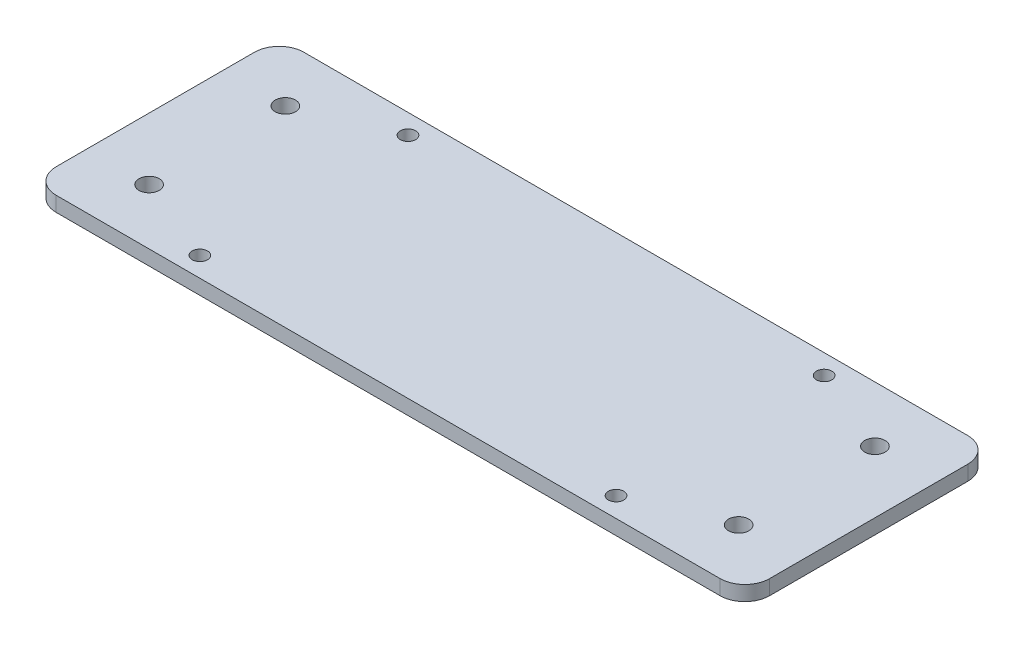
ISO-10303-21;
HEADER;
FILE_DESCRIPTION(('STEP AP214'),'2;1');
FILE_NAME('part.step','',(''),(''),'','','');
FILE_SCHEMA(('AUTOMOTIVE_DESIGN { 1 0 10303 214 1 1 1 1 }'));
ENDSEC;
DATA;
#1=APPLICATION_CONTEXT('core data for automotive mechanical design processes');
#2=APPLICATION_PROTOCOL_DEFINITION('international standard','automotive_design',2000,#1);
#3=PRODUCT_CONTEXT('',#1,'mechanical');
#4=PRODUCT('Part','Part','',(#3));
#5=PRODUCT_RELATED_PRODUCT_CATEGORY('part','',(#4));
#6=PRODUCT_DEFINITION_FORMATION('','',#4);
#7=PRODUCT_DEFINITION_CONTEXT('part definition',#1,'design');
#8=PRODUCT_DEFINITION('design','',#6,#7);
#9=PRODUCT_DEFINITION_SHAPE('','',#8);
#10=(LENGTH_UNIT() NAMED_UNIT(*) SI_UNIT(.MILLI.,.METRE.));
#11=(NAMED_UNIT(*) PLANE_ANGLE_UNIT() SI_UNIT($,.RADIAN.));
#12=(NAMED_UNIT(*) SI_UNIT($,.STERADIAN.) SOLID_ANGLE_UNIT());
#13=UNCERTAINTY_MEASURE_WITH_UNIT(LENGTH_MEASURE(1.E-05),#10,'distance_accuracy_value','');
#14=(GEOMETRIC_REPRESENTATION_CONTEXT(3) GLOBAL_UNCERTAINTY_ASSIGNED_CONTEXT((#13)) GLOBAL_UNIT_ASSIGNED_CONTEXT((#10,
#11,#12)) REPRESENTATION_CONTEXT('',''));
#15=CARTESIAN_POINT('',(0.,0.,0.));
#16=DIRECTION('',(0.,0.,1.));
#17=DIRECTION('',(1.,0.,0.));
#18=AXIS2_PLACEMENT_3D('',#15,#16,#17);
#19=CARTESIAN_POINT('',(0.,3.,0.));
#20=DIRECTION('',(0.,1.,0.));
#21=DIRECTION('',(0.,0.,1.));
#22=AXIS2_PLACEMENT_3D('',#19,#20,#21);
#23=PLANE('',#22);
#24=CARTESIAN_POINT('',(42.,3.,21.));
#25=DIRECTION('',(0.,1.,0.));
#26=DIRECTION('',(0.,0.,-1.));
#27=AXIS2_PLACEMENT_3D('',#24,#25,#26);
#28=CIRCLE('',#27,1.55);
#29=CARTESIAN_POINT('',(42.,3.,19.45));
#30=VERTEX_POINT('',#29);
#31=EDGE_CURVE('E214',#30,#30,#28,.T.);
#32=ORIENTED_EDGE('',*,*,#31,.F.);
#33=EDGE_LOOP('',(#32));
#34=FACE_BOUND('',#33,.T.);
#35=CARTESIAN_POINT('',(-59.5,3.,13.75));
#36=DIRECTION('',(0.,1.,0.));
#37=DIRECTION('',(0.,0.,1.));
#38=AXIS2_PLACEMENT_3D('',#35,#36,#37);
#39=CIRCLE('',#38,2.04999999999999);
#40=CARTESIAN_POINT('',(-59.5,3.,15.8));
#41=VERTEX_POINT('',#40);
#42=EDGE_CURVE('E202',#41,#41,#39,.T.);
#43=ORIENTED_EDGE('',*,*,#42,.F.);
#44=EDGE_LOOP('',(#43));
#45=FACE_BOUND('',#44,.T.);
#46=CARTESIAN_POINT('',(-42.,3.,-21.));
#47=DIRECTION('',(0.,1.,0.));
#48=DIRECTION('',(0.,0.,-1.));
#49=AXIS2_PLACEMENT_3D('',#46,#47,#48);
#50=CIRCLE('',#49,1.55);
#51=CARTESIAN_POINT('',(-42.,3.,-22.55));
#52=VERTEX_POINT('',#51);
#53=EDGE_CURVE('E190',#52,#52,#50,.T.);
#54=ORIENTED_EDGE('',*,*,#53,.F.);
#55=EDGE_LOOP('',(#54));
#56=FACE_BOUND('',#55,.T.);
#57=CARTESIAN_POINT('',(59.5,3.,-13.75));
#58=DIRECTION('',(0.,1.,0.));
#59=DIRECTION('',(0.,0.,1.));
#60=AXIS2_PLACEMENT_3D('',#57,#58,#59);
#61=CIRCLE('',#60,2.04999999999999);
#62=CARTESIAN_POINT('',(59.5,3.,-11.7));
#63=VERTEX_POINT('',#62);
#64=EDGE_CURVE('E180',#63,#63,#61,.T.);
#65=ORIENTED_EDGE('',*,*,#64,.F.);
#66=EDGE_LOOP('',(#65));
#67=FACE_BOUND('',#66,.T.);
#68=DIRECTION('',(-1.,0.,0.));
#69=VECTOR('',#68,1.);
#70=CARTESIAN_POINT('',(-72.,3.,-25.));
#71=LINE('',#70,#69);
#72=CARTESIAN_POINT('',(67.,3.,-25.));
#73=VERTEX_POINT('',#72);
#74=CARTESIAN_POINT('',(-67.,3.,-25.));
#75=VERTEX_POINT('',#74);
#76=EDGE_CURVE('E171',#73,#75,#71,.T.);
#77=ORIENTED_EDGE('',*,*,#76,.T.);
#78=CARTESIAN_POINT('',(-67.,3.,-20.));
#79=DIRECTION('',(0.,1.,0.));
#80=DIRECTION('',(0.,0.,1.));
#81=AXIS2_PLACEMENT_3D('',#78,#79,#80);
#82=CIRCLE('',#81,5.);
#83=CARTESIAN_POINT('',(-72.,3.,-20.));
#84=VERTEX_POINT('',#83);
#85=EDGE_CURVE('E149',#75,#84,#82,.T.);
#86=ORIENTED_EDGE('',*,*,#85,.T.);
#87=DIRECTION('',(0.,0.,1.));
#88=VECTOR('',#87,1.);
#89=CARTESIAN_POINT('',(-72.,3.,-25.));
#90=LINE('',#89,#88);
#91=CARTESIAN_POINT('',(-72.,3.,20.));
#92=VERTEX_POINT('',#91);
#93=EDGE_CURVE('E119',#84,#92,#90,.T.);
#94=ORIENTED_EDGE('',*,*,#93,.T.);
#95=CARTESIAN_POINT('',(-67.,3.,20.));
#96=DIRECTION('',(0.,1.,0.));
#97=DIRECTION('',(0.,0.,1.));
#98=AXIS2_PLACEMENT_3D('',#95,#96,#97);
#99=CIRCLE('',#98,5.);
#100=CARTESIAN_POINT('',(-67.,3.,25.));
#101=VERTEX_POINT('',#100);
#102=EDGE_CURVE('E55',#92,#101,#99,.T.);
#103=ORIENTED_EDGE('',*,*,#102,.T.);
#104=DIRECTION('',(1.,0.,0.));
#105=VECTOR('',#104,1.);
#106=CARTESIAN_POINT('',(-72.,3.,25.));
#107=LINE('',#106,#105);
#108=CARTESIAN_POINT('',(67.,3.,25.));
#109=VERTEX_POINT('',#108);
#110=EDGE_CURVE('E135',#101,#109,#107,.T.);
#111=ORIENTED_EDGE('',*,*,#110,.T.);
#112=CARTESIAN_POINT('',(67.,3.,20.));
#113=DIRECTION('',(0.,1.,0.));
#114=DIRECTION('',(0.,0.,1.));
#115=AXIS2_PLACEMENT_3D('',#112,#113,#114);
#116=CIRCLE('',#115,5.);
#117=CARTESIAN_POINT('',(72.,3.,20.));
#118=VERTEX_POINT('',#117);
#119=EDGE_CURVE('E145',#109,#118,#116,.T.);
#120=ORIENTED_EDGE('',*,*,#119,.T.);
#121=DIRECTION('',(0.,0.,-1.));
#122=VECTOR('',#121,1.);
#123=CARTESIAN_POINT('',(72.,3.,-25.));
#124=LINE('',#123,#122);
#125=CARTESIAN_POINT('',(72.,3.,-20.));
#126=VERTEX_POINT('',#125);
#127=EDGE_CURVE('E129',#118,#126,#124,.T.);
#128=ORIENTED_EDGE('',*,*,#127,.T.);
#129=CARTESIAN_POINT('',(67.,3.,-20.));
#130=DIRECTION('',(0.,1.,0.));
#131=DIRECTION('',(0.,0.,1.));
#132=AXIS2_PLACEMENT_3D('',#129,#130,#131);
#133=CIRCLE('',#132,5.);
#134=EDGE_CURVE('E147',#126,#73,#133,.T.);
#135=ORIENTED_EDGE('',*,*,#134,.T.);
#136=EDGE_LOOP('',(#77,#86,#94,#103,#111,#120,#128,#135));
#137=FACE_BOUND('',#136,.T.);
#138=CARTESIAN_POINT('',(42.,3.,-21.));
#139=DIRECTION('',(0.,1.,0.));
#140=DIRECTION('',(0.,0.,1.));
#141=AXIS2_PLACEMENT_3D('',#138,#139,#140);
#142=CIRCLE('',#141,1.55);
#143=CARTESIAN_POINT('',(42.,3.,-19.45));
#144=VERTEX_POINT('',#143);
#145=EDGE_CURVE('E185',#144,#144,#142,.T.);
#146=ORIENTED_EDGE('',*,*,#145,.F.);
#147=EDGE_LOOP('',(#146));
#148=FACE_BOUND('',#147,.T.);
#149=CARTESIAN_POINT('',(-59.5,3.,-13.75));
#150=DIRECTION('',(0.,1.,0.));
#151=DIRECTION('',(0.,0.,-1.));
#152=AXIS2_PLACEMENT_3D('',#149,#150,#151);
#153=CIRCLE('',#152,2.04999999999999);
#154=CARTESIAN_POINT('',(-59.5,3.,-15.8));
#155=VERTEX_POINT('',#154);
#156=EDGE_CURVE('E196',#155,#155,#153,.T.);
#157=ORIENTED_EDGE('',*,*,#156,.F.);
#158=EDGE_LOOP('',(#157));
#159=FACE_BOUND('',#158,.T.);
#160=CARTESIAN_POINT('',(-42.,3.,21.));
#161=DIRECTION('',(0.,1.,0.));
#162=DIRECTION('',(0.,0.,1.));
#163=AXIS2_PLACEMENT_3D('',#160,#161,#162);
#164=CIRCLE('',#163,1.55);
#165=CARTESIAN_POINT('',(-42.,3.,22.55));
#166=VERTEX_POINT('',#165);
#167=EDGE_CURVE('E208',#166,#166,#164,.T.);
#168=ORIENTED_EDGE('',*,*,#167,.F.);
#169=EDGE_LOOP('',(#168));
#170=FACE_BOUND('',#169,.T.);
#171=CARTESIAN_POINT('',(59.5,3.,13.75));
#172=DIRECTION('',(0.,1.,0.));
#173=DIRECTION('',(0.,0.,-1.));
#174=AXIS2_PLACEMENT_3D('',#171,#172,#173);
#175=CIRCLE('',#174,2.04999999999999);
#176=CARTESIAN_POINT('',(59.5,3.,11.7));
#177=VERTEX_POINT('',#176);
#178=EDGE_CURVE('E220',#177,#177,#175,.T.);
#179=ORIENTED_EDGE('',*,*,#178,.F.);
#180=EDGE_LOOP('',(#179));
#181=FACE_BOUND('',#180,.T.);
#182=ADVANCED_FACE('F35',(#34,#45,#56,#67,#137,#148,#159,#170,#181),#23,.T.);
#183=CARTESIAN_POINT('',(0.,0.,0.));
#184=DIRECTION('',(0.,1.,0.));
#185=DIRECTION('',(0.,0.,1.));
#186=AXIS2_PLACEMENT_3D('',#183,#184,#185);
#187=PLANE('',#186);
#188=DIRECTION('',(0.,0.,1.));
#189=VECTOR('',#188,1.);
#190=CARTESIAN_POINT('',(-72.,0.,-25.));
#191=LINE('',#190,#189);
#192=CARTESIAN_POINT('',(-72.,0.,-20.));
#193=VERTEX_POINT('',#192);
#194=CARTESIAN_POINT('',(-72.,0.,20.));
#195=VERTEX_POINT('',#194);
#196=EDGE_CURVE('E117',#193,#195,#191,.T.);
#197=ORIENTED_EDGE('',*,*,#196,.F.);
#198=CARTESIAN_POINT('',(-67.,0.,-20.));
#199=DIRECTION('',(0.,1.,0.));
#200=DIRECTION('',(0.,0.,1.));
#201=AXIS2_PLACEMENT_3D('',#198,#199,#200);
#202=CIRCLE('',#201,5.);
#203=CARTESIAN_POINT('',(-67.,0.,-25.));
#204=VERTEX_POINT('',#203);
#205=EDGE_CURVE('E100',#193,#204,#202,.F.);
#206=ORIENTED_EDGE('',*,*,#205,.T.);
#207=DIRECTION('',(-1.,0.,0.));
#208=VECTOR('',#207,1.);
#209=CARTESIAN_POINT('',(-72.,0.,-25.));
#210=LINE('',#209,#208);
#211=CARTESIAN_POINT('',(67.,0.,-25.));
#212=VERTEX_POINT('',#211);
#213=EDGE_CURVE('E127',#212,#204,#210,.T.);
#214=ORIENTED_EDGE('',*,*,#213,.F.);
#215=CARTESIAN_POINT('',(67.,0.,-20.));
#216=DIRECTION('',(0.,1.,0.));
#217=DIRECTION('',(0.,0.,1.));
#218=AXIS2_PLACEMENT_3D('',#215,#216,#217);
#219=CIRCLE('',#218,5.);
#220=CARTESIAN_POINT('',(72.,0.,-20.));
#221=VERTEX_POINT('',#220);
#222=EDGE_CURVE('E111',#212,#221,#219,.F.);
#223=ORIENTED_EDGE('',*,*,#222,.T.);
#224=DIRECTION('',(0.,0.,-1.));
#225=VECTOR('',#224,1.);
#226=CARTESIAN_POINT('',(72.,0.,-25.));
#227=LINE('',#226,#225);
#228=CARTESIAN_POINT('',(72.,0.,20.));
#229=VERTEX_POINT('',#228);
#230=EDGE_CURVE('E131',#229,#221,#227,.T.);
#231=ORIENTED_EDGE('',*,*,#230,.F.);
#232=CARTESIAN_POINT('',(67.,0.,20.));
#233=DIRECTION('',(0.,1.,0.));
#234=DIRECTION('',(0.,0.,1.));
#235=AXIS2_PLACEMENT_3D('',#232,#233,#234);
#236=CIRCLE('',#235,5.);
#237=CARTESIAN_POINT('',(67.,0.,25.));
#238=VERTEX_POINT('',#237);
#239=EDGE_CURVE('E138',#229,#238,#236,.F.);
#240=ORIENTED_EDGE('',*,*,#239,.T.);
#241=DIRECTION('',(1.,0.,0.));
#242=VECTOR('',#241,1.);
#243=CARTESIAN_POINT('',(-72.,0.,25.));
#244=LINE('',#243,#242);
#245=CARTESIAN_POINT('',(-67.,0.,25.));
#246=VERTEX_POINT('',#245);
#247=EDGE_CURVE('E126',#246,#238,#244,.T.);
#248=ORIENTED_EDGE('',*,*,#247,.F.);
#249=CARTESIAN_POINT('',(-67.,0.,20.));
#250=DIRECTION('',(0.,1.,0.));
#251=DIRECTION('',(0.,0.,1.));
#252=AXIS2_PLACEMENT_3D('',#249,#250,#251);
#253=CIRCLE('',#252,5.);
#254=EDGE_CURVE('E120',#246,#195,#253,.F.);
#255=ORIENTED_EDGE('',*,*,#254,.T.);
#256=EDGE_LOOP('',(#197,#206,#214,#223,#231,#240,#248,#255));
#257=FACE_BOUND('',#256,.T.);
#258=CARTESIAN_POINT('',(59.5,0.,-13.75));
#259=DIRECTION('',(0.,1.,0.));
#260=DIRECTION('',(0.,0.,1.));
#261=AXIS2_PLACEMENT_3D('',#258,#259,#260);
#262=CIRCLE('',#261,2.04999999999999);
#263=CARTESIAN_POINT('',(59.5,0.,-11.7));
#264=VERTEX_POINT('',#263);
#265=EDGE_CURVE('E176',#264,#264,#262,.T.);
#266=ORIENTED_EDGE('',*,*,#265,.T.);
#267=EDGE_LOOP('',(#266));
#268=FACE_BOUND('',#267,.T.);
#269=CARTESIAN_POINT('',(42.,0.,-21.));
#270=DIRECTION('',(0.,1.,0.));
#271=DIRECTION('',(0.,0.,1.));
#272=AXIS2_PLACEMENT_3D('',#269,#270,#271);
#273=CIRCLE('',#272,1.55);
#274=CARTESIAN_POINT('',(42.,0.,-19.45));
#275=VERTEX_POINT('',#274);
#276=EDGE_CURVE('E187',#275,#275,#273,.T.);
#277=ORIENTED_EDGE('',*,*,#276,.T.);
#278=EDGE_LOOP('',(#277));
#279=FACE_BOUND('',#278,.T.);
#280=CARTESIAN_POINT('',(-42.,0.,-21.));
#281=DIRECTION('',(0.,1.,0.));
#282=DIRECTION('',(0.,0.,-1.));
#283=AXIS2_PLACEMENT_3D('',#280,#281,#282);
#284=CIRCLE('',#283,1.55);
#285=CARTESIAN_POINT('',(-42.,0.,-22.55));
#286=VERTEX_POINT('',#285);
#287=EDGE_CURVE('E193',#286,#286,#284,.T.);
#288=ORIENTED_EDGE('',*,*,#287,.T.);
#289=EDGE_LOOP('',(#288));
#290=FACE_BOUND('',#289,.T.);
#291=CARTESIAN_POINT('',(-59.5,0.,-13.75));
#292=DIRECTION('',(0.,1.,0.));
#293=DIRECTION('',(0.,0.,-1.));
#294=AXIS2_PLACEMENT_3D('',#291,#292,#293);
#295=CIRCLE('',#294,2.04999999999999);
#296=CARTESIAN_POINT('',(-59.5,0.,-15.8));
#297=VERTEX_POINT('',#296);
#298=EDGE_CURVE('E199',#297,#297,#295,.T.);
#299=ORIENTED_EDGE('',*,*,#298,.T.);
#300=EDGE_LOOP('',(#299));
#301=FACE_BOUND('',#300,.T.);
#302=CARTESIAN_POINT('',(-59.5,0.,13.75));
#303=DIRECTION('',(0.,1.,0.));
#304=DIRECTION('',(0.,0.,1.));
#305=AXIS2_PLACEMENT_3D('',#302,#303,#304);
#306=CIRCLE('',#305,2.04999999999999);
#307=CARTESIAN_POINT('',(-59.5,0.,15.8));
#308=VERTEX_POINT('',#307);
#309=EDGE_CURVE('E205',#308,#308,#306,.T.);
#310=ORIENTED_EDGE('',*,*,#309,.T.);
#311=EDGE_LOOP('',(#310));
#312=FACE_BOUND('',#311,.T.);
#313=CARTESIAN_POINT('',(-42.,0.,21.));
#314=DIRECTION('',(0.,1.,0.));
#315=DIRECTION('',(0.,0.,1.));
#316=AXIS2_PLACEMENT_3D('',#313,#314,#315);
#317=CIRCLE('',#316,1.55);
#318=CARTESIAN_POINT('',(-42.,0.,22.55));
#319=VERTEX_POINT('',#318);
#320=EDGE_CURVE('E211',#319,#319,#317,.T.);
#321=ORIENTED_EDGE('',*,*,#320,.T.);
#322=EDGE_LOOP('',(#321));
#323=FACE_BOUND('',#322,.T.);
#324=CARTESIAN_POINT('',(42.,0.,21.));
#325=DIRECTION('',(0.,1.,0.));
#326=DIRECTION('',(0.,0.,-1.));
#327=AXIS2_PLACEMENT_3D('',#324,#325,#326);
#328=CIRCLE('',#327,1.55);
#329=CARTESIAN_POINT('',(42.,0.,19.45));
#330=VERTEX_POINT('',#329);
#331=EDGE_CURVE('E217',#330,#330,#328,.T.);
#332=ORIENTED_EDGE('',*,*,#331,.T.);
#333=EDGE_LOOP('',(#332));
#334=FACE_BOUND('',#333,.T.);
#335=CARTESIAN_POINT('',(59.5,0.,13.75));
#336=DIRECTION('',(0.,1.,0.));
#337=DIRECTION('',(0.,0.,-1.));
#338=AXIS2_PLACEMENT_3D('',#335,#336,#337);
#339=CIRCLE('',#338,2.04999999999999);
#340=CARTESIAN_POINT('',(59.5,0.,11.7));
#341=VERTEX_POINT('',#340);
#342=EDGE_CURVE('E223',#341,#341,#339,.T.);
#343=ORIENTED_EDGE('',*,*,#342,.T.);
#344=EDGE_LOOP('',(#343));
#345=FACE_BOUND('',#344,.T.);
#346=ADVANCED_FACE('F123',(#257,#268,#279,#290,#301,#312,#323,#334,#345),#187,.F.);
#347=CARTESIAN_POINT('',(72.,3.,-25.));
#348=DIRECTION('',(-1.,0.,0.));
#349=DIRECTION('',(0.,0.,1.));
#350=AXIS2_PLACEMENT_3D('',#347,#348,#349);
#351=PLANE('',#350);
#352=ORIENTED_EDGE('',*,*,#230,.T.);
#353=DIRECTION('',(0.,-1.,0.));
#354=VECTOR('',#353,1.);
#355=CARTESIAN_POINT('',(72.,3.,-20.));
#356=LINE('',#355,#354);
#357=EDGE_CURVE('E154',#221,#126,#356,.F.);
#358=ORIENTED_EDGE('',*,*,#357,.T.);
#359=ORIENTED_EDGE('',*,*,#127,.F.);
#360=DIRECTION('',(0.,-1.,0.));
#361=VECTOR('',#360,1.);
#362=CARTESIAN_POINT('',(72.,3.,20.));
#363=LINE('',#362,#361);
#364=EDGE_CURVE('E151',#118,#229,#363,.T.);
#365=ORIENTED_EDGE('',*,*,#364,.T.);
#366=EDGE_LOOP('',(#352,#358,#359,#365));
#367=FACE_BOUND('',#366,.T.);
#368=ADVANCED_FACE('F167',(#367),#351,.F.);
#369=CARTESIAN_POINT('',(-72.,3.,-25.));
#370=DIRECTION('',(0.,0.,1.));
#371=DIRECTION('',(1.,0.,0.));
#372=AXIS2_PLACEMENT_3D('',#369,#370,#371);
#373=PLANE('',#372);
#374=ORIENTED_EDGE('',*,*,#213,.T.);
#375=DIRECTION('',(0.,-1.,0.));
#376=VECTOR('',#375,1.);
#377=CARTESIAN_POINT('',(-67.,3.,-25.));
#378=LINE('',#377,#376);
#379=EDGE_CURVE('E105',#204,#75,#378,.F.);
#380=ORIENTED_EDGE('',*,*,#379,.T.);
#381=ORIENTED_EDGE('',*,*,#76,.F.);
#382=DIRECTION('',(0.,-1.,0.));
#383=VECTOR('',#382,1.);
#384=CARTESIAN_POINT('',(67.,3.,-25.));
#385=LINE('',#384,#383);
#386=EDGE_CURVE('E110',#73,#212,#385,.T.);
#387=ORIENTED_EDGE('',*,*,#386,.T.);
#388=EDGE_LOOP('',(#374,#380,#381,#387));
#389=FACE_BOUND('',#388,.T.);
#390=ADVANCED_FACE('F249',(#389),#373,.F.);
#391=CARTESIAN_POINT('',(-72.,3.,-25.));
#392=DIRECTION('',(1.,0.,0.));
#393=DIRECTION('',(0.,0.,-1.));
#394=AXIS2_PLACEMENT_3D('',#391,#392,#393);
#395=PLANE('',#394);
#396=ORIENTED_EDGE('',*,*,#93,.F.);
#397=DIRECTION('',(0.,-1.,0.));
#398=VECTOR('',#397,1.);
#399=CARTESIAN_POINT('',(-72.,3.,-20.));
#400=LINE('',#399,#398);
#401=EDGE_CURVE('E104',#84,#193,#400,.T.);
#402=ORIENTED_EDGE('',*,*,#401,.T.);
#403=ORIENTED_EDGE('',*,*,#196,.T.);
#404=DIRECTION('',(0.,-1.,0.));
#405=VECTOR('',#404,1.);
#406=CARTESIAN_POINT('',(-72.,3.,20.));
#407=LINE('',#406,#405);
#408=EDGE_CURVE('E121',#195,#92,#407,.F.);
#409=ORIENTED_EDGE('',*,*,#408,.T.);
#410=EDGE_LOOP('',(#396,#402,#403,#409));
#411=FACE_BOUND('',#410,.T.);
#412=ADVANCED_FACE('F116',(#411),#395,.F.);
#413=CARTESIAN_POINT('',(-72.,3.,25.));
#414=DIRECTION('',(0.,0.,-1.));
#415=DIRECTION('',(-1.,0.,0.));
#416=AXIS2_PLACEMENT_3D('',#413,#414,#415);
#417=PLANE('',#416);
#418=ORIENTED_EDGE('',*,*,#247,.T.);
#419=DIRECTION('',(0.,-1.,0.));
#420=VECTOR('',#419,1.);
#421=CARTESIAN_POINT('',(67.,3.,25.));
#422=LINE('',#421,#420);
#423=EDGE_CURVE('E11',#238,#109,#422,.F.);
#424=ORIENTED_EDGE('',*,*,#423,.T.);
#425=ORIENTED_EDGE('',*,*,#110,.F.);
#426=DIRECTION('',(0.,-1.,0.));
#427=VECTOR('',#426,1.);
#428=CARTESIAN_POINT('',(-67.,3.,25.));
#429=LINE('',#428,#427);
#430=EDGE_CURVE('E43',#101,#246,#429,.T.);
#431=ORIENTED_EDGE('',*,*,#430,.T.);
#432=EDGE_LOOP('',(#418,#424,#425,#431));
#433=FACE_BOUND('',#432,.T.);
#434=ADVANCED_FACE('F157',(#433),#417,.F.);
#435=CARTESIAN_POINT('',(59.5,3.,-13.75));
#436=DIRECTION('',(0.,-1.,0.));
#437=DIRECTION('',(0.,0.,-1.));
#438=AXIS2_PLACEMENT_3D('',#435,#436,#437);
#439=CYLINDRICAL_SURFACE('',#438,2.04999999999999);
#440=ORIENTED_EDGE('',*,*,#64,.T.);
#441=EDGE_LOOP('',(#440));
#442=FACE_BOUND('',#441,.T.);
#443=ORIENTED_EDGE('',*,*,#265,.F.);
#444=EDGE_LOOP('',(#443));
#445=FACE_BOUND('',#444,.T.);
#446=ADVANCED_FACE('F242',(#442,#445),#439,.F.);
#447=CARTESIAN_POINT('',(42.,3.,-21.));
#448=DIRECTION('',(0.,-1.,0.));
#449=DIRECTION('',(0.,0.,-1.));
#450=AXIS2_PLACEMENT_3D('',#447,#448,#449);
#451=CYLINDRICAL_SURFACE('',#450,1.55);
#452=ORIENTED_EDGE('',*,*,#145,.T.);
#453=EDGE_LOOP('',(#452));
#454=FACE_BOUND('',#453,.T.);
#455=ORIENTED_EDGE('',*,*,#276,.F.);
#456=EDGE_LOOP('',(#455));
#457=FACE_BOUND('',#456,.T.);
#458=ADVANCED_FACE('F304',(#454,#457),#451,.F.);
#459=CARTESIAN_POINT('',(-42.,3.,-21.));
#460=DIRECTION('',(0.,-1.,0.));
#461=DIRECTION('',(0.,0.,-1.));
#462=AXIS2_PLACEMENT_3D('',#459,#460,#461);
#463=CYLINDRICAL_SURFACE('',#462,1.55);
#464=ORIENTED_EDGE('',*,*,#53,.T.);
#465=EDGE_LOOP('',(#464));
#466=FACE_BOUND('',#465,.T.);
#467=ORIENTED_EDGE('',*,*,#287,.F.);
#468=EDGE_LOOP('',(#467));
#469=FACE_BOUND('',#468,.T.);
#470=ADVANCED_FACE('F301',(#466,#469),#463,.F.);
#471=CARTESIAN_POINT('',(-59.5,3.,-13.75));
#472=DIRECTION('',(0.,-1.,0.));
#473=DIRECTION('',(0.,0.,-1.));
#474=AXIS2_PLACEMENT_3D('',#471,#472,#473);
#475=CYLINDRICAL_SURFACE('',#474,2.04999999999999);
#476=ORIENTED_EDGE('',*,*,#156,.T.);
#477=EDGE_LOOP('',(#476));
#478=FACE_BOUND('',#477,.T.);
#479=ORIENTED_EDGE('',*,*,#298,.F.);
#480=EDGE_LOOP('',(#479));
#481=FACE_BOUND('',#480,.T.);
#482=ADVANCED_FACE('F297',(#478,#481),#475,.F.);
#483=CARTESIAN_POINT('',(-59.5,3.,13.75));
#484=DIRECTION('',(0.,-1.,0.));
#485=DIRECTION('',(0.,0.,-1.));
#486=AXIS2_PLACEMENT_3D('',#483,#484,#485);
#487=CYLINDRICAL_SURFACE('',#486,2.04999999999999);
#488=ORIENTED_EDGE('',*,*,#42,.T.);
#489=EDGE_LOOP('',(#488));
#490=FACE_BOUND('',#489,.T.);
#491=ORIENTED_EDGE('',*,*,#309,.F.);
#492=EDGE_LOOP('',(#491));
#493=FACE_BOUND('',#492,.T.);
#494=ADVANCED_FACE('F279',(#490,#493),#487,.F.);
#495=CARTESIAN_POINT('',(-42.,3.,21.));
#496=DIRECTION('',(0.,-1.,0.));
#497=DIRECTION('',(0.,0.,-1.));
#498=AXIS2_PLACEMENT_3D('',#495,#496,#497);
#499=CYLINDRICAL_SURFACE('',#498,1.55);
#500=ORIENTED_EDGE('',*,*,#167,.T.);
#501=EDGE_LOOP('',(#500));
#502=FACE_BOUND('',#501,.T.);
#503=ORIENTED_EDGE('',*,*,#320,.F.);
#504=EDGE_LOOP('',(#503));
#505=FACE_BOUND('',#504,.T.);
#506=ADVANCED_FACE('F275',(#502,#505),#499,.F.);
#507=CARTESIAN_POINT('',(42.,3.,21.));
#508=DIRECTION('',(0.,-1.,0.));
#509=DIRECTION('',(0.,0.,-1.));
#510=AXIS2_PLACEMENT_3D('',#507,#508,#509);
#511=CYLINDRICAL_SURFACE('',#510,1.55);
#512=ORIENTED_EDGE('',*,*,#31,.T.);
#513=EDGE_LOOP('',(#512));
#514=FACE_BOUND('',#513,.T.);
#515=ORIENTED_EDGE('',*,*,#331,.F.);
#516=EDGE_LOOP('',(#515));
#517=FACE_BOUND('',#516,.T.);
#518=ADVANCED_FACE('F278',(#514,#517),#511,.F.);
#519=CARTESIAN_POINT('',(59.5,3.,13.75));
#520=DIRECTION('',(0.,-1.,0.));
#521=DIRECTION('',(0.,0.,-1.));
#522=AXIS2_PLACEMENT_3D('',#519,#520,#521);
#523=CYLINDRICAL_SURFACE('',#522,2.04999999999999);
#524=ORIENTED_EDGE('',*,*,#178,.T.);
#525=EDGE_LOOP('',(#524));
#526=FACE_BOUND('',#525,.T.);
#527=ORIENTED_EDGE('',*,*,#342,.F.);
#528=EDGE_LOOP('',(#527));
#529=FACE_BOUND('',#528,.T.);
#530=ADVANCED_FACE('F229',(#526,#529),#523,.F.);
#531=CARTESIAN_POINT('',(-67.,3.,-20.));
#532=DIRECTION('',(0.,-1.,0.));
#533=DIRECTION('',(0.,0.,-1.));
#534=AXIS2_PLACEMENT_3D('',#531,#532,#533);
#535=CYLINDRICAL_SURFACE('',#534,5.);
#536=ORIENTED_EDGE('',*,*,#85,.F.);
#537=ORIENTED_EDGE('',*,*,#379,.F.);
#538=ORIENTED_EDGE('',*,*,#205,.F.);
#539=ORIENTED_EDGE('',*,*,#401,.F.);
#540=EDGE_LOOP('',(#536,#537,#538,#539));
#541=FACE_BOUND('',#540,.T.);
#542=ADVANCED_FACE('F103',(#541),#535,.T.);
#543=CARTESIAN_POINT('',(67.,3.,-20.));
#544=DIRECTION('',(0.,-1.,0.));
#545=DIRECTION('',(0.,0.,-1.));
#546=AXIS2_PLACEMENT_3D('',#543,#544,#545);
#547=CYLINDRICAL_SURFACE('',#546,5.);
#548=ORIENTED_EDGE('',*,*,#134,.F.);
#549=ORIENTED_EDGE('',*,*,#357,.F.);
#550=ORIENTED_EDGE('',*,*,#222,.F.);
#551=ORIENTED_EDGE('',*,*,#386,.F.);
#552=EDGE_LOOP('',(#548,#549,#550,#551));
#553=FACE_BOUND('',#552,.T.);
#554=ADVANCED_FACE('F257',(#553),#547,.T.);
#555=CARTESIAN_POINT('',(67.,3.,20.));
#556=DIRECTION('',(0.,-1.,0.));
#557=DIRECTION('',(0.,0.,-1.));
#558=AXIS2_PLACEMENT_3D('',#555,#556,#557);
#559=CYLINDRICAL_SURFACE('',#558,5.);
#560=ORIENTED_EDGE('',*,*,#119,.F.);
#561=ORIENTED_EDGE('',*,*,#423,.F.);
#562=ORIENTED_EDGE('',*,*,#239,.F.);
#563=ORIENTED_EDGE('',*,*,#364,.F.);
#564=EDGE_LOOP('',(#560,#561,#562,#563));
#565=FACE_BOUND('',#564,.T.);
#566=ADVANCED_FACE('F164',(#565),#559,.T.);
#567=CARTESIAN_POINT('',(-67.,3.,20.));
#568=DIRECTION('',(0.,-1.,0.));
#569=DIRECTION('',(0.,0.,-1.));
#570=AXIS2_PLACEMENT_3D('',#567,#568,#569);
#571=CYLINDRICAL_SURFACE('',#570,5.);
#572=ORIENTED_EDGE('',*,*,#102,.F.);
#573=ORIENTED_EDGE('',*,*,#408,.F.);
#574=ORIENTED_EDGE('',*,*,#254,.F.);
#575=ORIENTED_EDGE('',*,*,#430,.F.);
#576=EDGE_LOOP('',(#572,#573,#574,#575));
#577=FACE_BOUND('',#576,.T.);
#578=ADVANCED_FACE('F37',(#577),#571,.T.);
#579=CLOSED_SHELL('',(#182,#346,#368,#390,#412,#434,#446,#458,#470,#482,#494,#506,#518,#530,
#542,#554,#566,#578));
#580=MANIFOLD_SOLID_BREP('B2',#579);
#581=ADVANCED_BREP_SHAPE_REPRESENTATION('',(#18,#580),#14);
#582=SHAPE_DEFINITION_REPRESENTATION(#9,#581);
ENDSEC;
END-ISO-10303-21;
